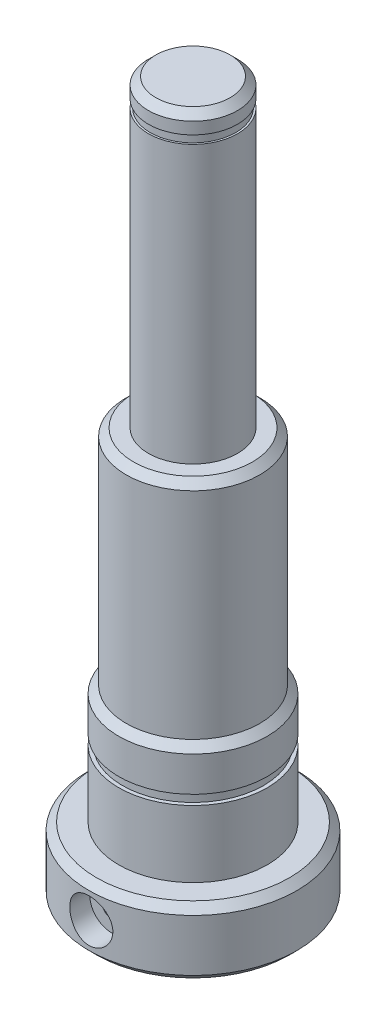
ISO-10303-21;
HEADER;
FILE_DESCRIPTION(('STEP AP214'),'2;1');
FILE_NAME('part.step','',(''),(''),'','','');
FILE_SCHEMA(('AUTOMOTIVE_DESIGN { 1 0 10303 214 1 1 1 1 }'));
ENDSEC;
DATA;
#1=APPLICATION_CONTEXT('core data for automotive mechanical design processes');
#2=APPLICATION_PROTOCOL_DEFINITION('international standard','automotive_design',2000,#1);
#3=PRODUCT_CONTEXT('',#1,'mechanical');
#4=PRODUCT('Part','Part','',(#3));
#5=PRODUCT_RELATED_PRODUCT_CATEGORY('part','',(#4));
#6=PRODUCT_DEFINITION_FORMATION('','',#4);
#7=PRODUCT_DEFINITION_CONTEXT('part definition',#1,'design');
#8=PRODUCT_DEFINITION('design','',#6,#7);
#9=PRODUCT_DEFINITION_SHAPE('','',#8);
#10=(LENGTH_UNIT() NAMED_UNIT(*) SI_UNIT(.MILLI.,.METRE.));
#11=(NAMED_UNIT(*) PLANE_ANGLE_UNIT() SI_UNIT($,.RADIAN.));
#12=(NAMED_UNIT(*) SI_UNIT($,.STERADIAN.) SOLID_ANGLE_UNIT());
#13=UNCERTAINTY_MEASURE_WITH_UNIT(LENGTH_MEASURE(1.E-05),#10,'distance_accuracy_value','');
#14=(GEOMETRIC_REPRESENTATION_CONTEXT(3) GLOBAL_UNCERTAINTY_ASSIGNED_CONTEXT((#13)) GLOBAL_UNIT_ASSIGNED_CONTEXT((#10,
#11,#12)) REPRESENTATION_CONTEXT('',''));
#15=CARTESIAN_POINT('',(0.,0.,0.));
#16=DIRECTION('',(0.,0.,1.));
#17=DIRECTION('',(1.,0.,0.));
#18=AXIS2_PLACEMENT_3D('',#15,#16,#17);
#19=CARTESIAN_POINT('',(-10.,0.,0.));
#20=DIRECTION('',(0.,1.,0.));
#21=DIRECTION('',(-1.,0.,0.));
#22=AXIS2_PLACEMENT_3D('',#19,#20,#21);
#23=PLANE('',#22);
#24=CARTESIAN_POINT('',(0.,0.,0.));
#25=DIRECTION('',(0.,-1.,0.));
#26=DIRECTION('',(1.,0.,0.));
#27=AXIS2_PLACEMENT_3D('',#24,#25,#26);
#28=CIRCLE('',#27,5.05);
#29=CARTESIAN_POINT('',(5.05,0.,0.));
#30=VERTEX_POINT('',#29);
#31=EDGE_CURVE('E264',#30,#30,#28,.T.);
#32=ORIENTED_EDGE('',*,*,#31,.F.);
#33=EDGE_LOOP('',(#32));
#34=FACE_BOUND('',#33,.T.);
#35=CARTESIAN_POINT('',(0.,0.,0.));
#36=DIRECTION('',(0.,1.,0.));
#37=DIRECTION('',(-1.,0.,0.));
#38=AXIS2_PLACEMENT_3D('',#35,#36,#37);
#39=CIRCLE('',#38,13.);
#40=CARTESIAN_POINT('',(-13.,0.,0.));
#41=VERTEX_POINT('',#40);
#42=EDGE_CURVE('E186',#41,#41,#39,.F.);
#43=ORIENTED_EDGE('',*,*,#42,.T.);
#44=EDGE_LOOP('',(#43));
#45=FACE_BOUND('',#44,.T.);
#46=ADVANCED_FACE('F39',(#34,#45),#23,.F.);
#47=CARTESIAN_POINT('',(0.,0.,0.));
#48=DIRECTION('',(0.,-1.,0.));
#49=DIRECTION('',(1.,0.,0.));
#50=AXIS2_PLACEMENT_3D('',#47,#48,#49);
#51=CYLINDRICAL_SURFACE('',#50,14.);
#52=CARTESIAN_POINT('',(2.9,4.49999999999998,13.6963498787086));
#53=CARTESIAN_POINT('',(2.89999419383572,4.33899189271043,13.6963531115589));
#54=CARTESIAN_POINT('',(2.88654567046469,4.17791192499995,13.6992198755548));
#55=CARTESIAN_POINT('',(2.83315693105658,3.86031772805241,13.7103587805877));
#56=CARTESIAN_POINT('',(2.79319627886301,3.70380711821791,13.7186350913543));
#57=CARTESIAN_POINT('',(2.68808300690295,3.39999209421434,13.7396164449994));
#58=CARTESIAN_POINT('',(2.62295640091256,3.2526783553913,13.7523169133426));
#59=CARTESIAN_POINT('',(2.46943239324666,2.97106942830747,13.7807100974141));
#60=CARTESIAN_POINT('',(2.38103598390965,2.8367736852296,13.7964026855361));
#61=CARTESIAN_POINT('',(2.18205302085246,2.58297165466539,13.8292777556743));
#62=CARTESIAN_POINT('',(2.07118088994073,2.46369147457871,13.8464776053231));
#63=CARTESIAN_POINT('',(1.83101056757053,2.24528279381873,13.880276655425));
#64=CARTESIAN_POINT('',(1.70171103465584,2.14615576150634,13.8968758120391));
#65=CARTESIAN_POINT('',(1.42685194414286,1.96998347972187,13.9277912082507));
#66=CARTESIAN_POINT('',(1.28115124652133,1.89315407439079,13.9420845741198));
#67=CARTESIAN_POINT('',(0.978562694793327,1.76515210202879,13.9665824115249));
#68=CARTESIAN_POINT('',(0.821675966610431,1.71397695693532,13.9767872939026));
#69=CARTESIAN_POINT('',(0.503517071550294,1.63944276807035,13.9918356398737));
#70=CARTESIAN_POINT('',(0.342337967901413,1.61570157797417,13.9967526924603));
#71=CARTESIAN_POINT('',(0.0182145482569576,1.59551600391564,14.0009258164044));
#72=CARTESIAN_POINT('',(-0.144729584076193,1.59906880657629,14.0001824712174));
#73=CARTESIAN_POINT('',(-0.465128603892373,1.63308246398363,13.9931752865473));
#74=CARTESIAN_POINT('',(-0.622629318310901,1.66313158736733,13.986995921826));
#75=CARTESIAN_POINT('',(-0.9303031886085,1.74863070927127,13.9699066360982));
#76=CARTESIAN_POINT('',(-1.0804760362834,1.80408177515958,13.9589965163103));
#77=CARTESIAN_POINT('',(-1.37039413565168,1.93918572525244,13.9335336062274));
#78=CARTESIAN_POINT('',(-1.5100629448243,2.01899796381199,13.9189569457963));
#79=CARTESIAN_POINT('',(-1.77417681627177,2.20044043808145,13.8877647093077));
#80=CARTESIAN_POINT('',(-1.89862000325996,2.30207335713007,13.871148882597));
#81=CARTESIAN_POINT('',(-2.1311956456326,2.52652464052962,13.8373442467169));
#82=CARTESIAN_POINT('',(-2.23897989621989,2.64970336528737,13.8201505324226));
#83=CARTESIAN_POINT('',(-2.43242126605807,2.91256319811965,13.7874210955904));
#84=CARTESIAN_POINT('',(-2.5180779036366,3.05224466532831,13.7718854091486));
#85=CARTESIAN_POINT('',(-2.66496539973842,3.34466827327105,13.7442200980446));
#86=CARTESIAN_POINT('',(-2.72613640074427,3.49744132518152,13.7320988414399));
#87=CARTESIAN_POINT('',(-2.82183680504096,3.81140720012852,13.7127548358361));
#88=CARTESIAN_POINT('',(-2.85636995731472,3.97259883493181,13.7055313975405));
#89=CARTESIAN_POINT('',(-2.89728670050617,4.29566073500499,13.6969399332338));
#90=CARTESIAN_POINT('',(-2.90417467653727,4.45746440080765,13.6954670031778));
#91=CARTESIAN_POINT('',(-2.89096588662787,4.77990841463909,13.698261219576));
#92=CARTESIAN_POINT('',(-2.87087076985745,4.94054883316067,13.702528015226));
#93=CARTESIAN_POINT('',(-2.80470210853869,5.25438848473026,13.7162223763224));
#94=CARTESIAN_POINT('',(-2.75890113791714,5.40764776614183,13.7255957635616));
#95=CARTESIAN_POINT('',(-2.64291369972917,5.70431730477971,13.7483991495977));
#96=CARTESIAN_POINT('',(-2.57272510027015,5.84772669964571,13.7618295030289));
#97=CARTESIAN_POINT('',(-2.40882441871586,6.12282363742768,13.7914673051063));
#98=CARTESIAN_POINT('',(-2.3147985478545,6.2543202664384,13.8077108021135));
#99=CARTESIAN_POINT('',(-2.10630777635164,6.49985326061864,13.8410471966416));
#100=CARTESIAN_POINT('',(-1.99184061144914,6.61388768891632,13.8581401881088));
#101=CARTESIAN_POINT('',(-1.74344548610602,6.823188456802,13.8915920807418));
#102=CARTESIAN_POINT('',(-1.60922662680789,6.91811269768244,13.9079341363376));
#103=CARTESIAN_POINT('',(-1.32645412016391,7.0840646834425,13.9377437789464));
#104=CARTESIAN_POINT('',(-1.17790110219979,7.1550934769054,13.9512114920821));
#105=CARTESIAN_POINT('',(-0.8715491822251,7.2707478910436,13.9736833984818));
#106=CARTESIAN_POINT('',(-0.713811451498223,7.31553017971465,13.9827140237285));
#107=CARTESIAN_POINT('',(-0.392845659036279,7.37791429983436,13.9954079655653));
#108=CARTESIAN_POINT('',(-0.229618311902394,7.39551965510691,13.9990719779996));
#109=CARTESIAN_POINT('',(0.0944332349038258,7.40290548875582,14.0006018410895));
#110=CARTESIAN_POINT('',(0.255245456322685,7.39319894565795,13.9985745880682));
#111=CARTESIAN_POINT('',(0.572893884029994,7.34737465224898,13.9891760402659));
#112=CARTESIAN_POINT('',(0.72973014793017,7.31125728485797,13.9818048229648));
#113=CARTESIAN_POINT('',(1.03462624687711,7.21387137084941,13.9625514329466));
#114=CARTESIAN_POINT('',(1.18270789042595,7.15266862061993,13.9506810671197));
#115=CARTESIAN_POINT('',(1.46657194416384,7.00691628119889,13.9237035246461));
#116=CARTESIAN_POINT('',(1.60235329624413,6.92236468599613,13.9085960699104));
#117=CARTESIAN_POINT('',(1.86028639332376,6.73060575116727,13.8764742390957));
#118=CARTESIAN_POINT('',(1.98216349296366,6.62303369623924,13.8594315298296));
#119=CARTESIAN_POINT('',(2.20631240679578,6.38903181149866,13.8255223197402));
#120=CARTESIAN_POINT('',(2.30857954447706,6.26259749623426,13.8086558618532));
#121=CARTESIAN_POINT('',(2.49175012962904,5.99268109455452,13.7767902425913));
#122=CARTESIAN_POINT('',(2.57238924861947,5.84901663507739,13.7618152730426));
#123=CARTESIAN_POINT('',(2.70825336871188,5.54990262491661,13.7357266802901));
#124=CARTESIAN_POINT('',(2.76350085513874,5.39446364371101,13.7246096428755));
#125=CARTESIAN_POINT('',(2.83661364154142,5.11561840642823,13.7096544304373));
#126=CARTESIAN_POINT('',(2.86033988035004,4.99377497518744,13.704696946509));
#127=CARTESIAN_POINT('',(2.89203498521578,4.74796851558947,13.6980434899225));
#128=CARTESIAN_POINT('',(2.90000447180411,4.62400557089675,13.6963473888249));
#129=CARTESIAN_POINT('',(2.9,4.49999999999998,13.6963498787086));
#130=B_SPLINE_CURVE_WITH_KNOTS('',3,(#52,#53,#54,#55,#56,#57,#58,#59,#60,#61,#62,#63,#64,#65,
#66,#67,#68,#69,#70,#71,#72,#73,#74,#75,#76,#77,#78,#79,#80,#81,#82,#83,#84,#85,#86,#87,#88,#89,
#90,#91,#92,#93,#94,#95,#96,#97,#98,#99,#100,#101,#102,#103,#104,#105,#106,#107,#108,#109,#110,
#111,#112,#113,#114,#115,#116,#117,#118,#119,#120,#121,#122,#123,#124,#125,#126,#127,#128,#129),
.UNSPECIFIED.,.T.,.F.,(4,2,2,2,2,2,2,2,2,2,2,2,2,2,2,2,2,2,2,2,2,2,2,2,2,2,2,2,2,2,2,2,2,2,2,2,
2,2,4),(0.,0.482570124451126,0.965512657858809,1.44795730845197,1.93038138857199,
2.41936987488557,2.90839397620443,3.40200502933799,3.89556646827906,4.38216656817056,
4.86871651156156,5.3478365313325,5.82697668516702,6.30932077454342,6.79172421287749,
7.28314117588915,7.77456883513029,8.26719060582867,8.75974303279931,9.2432668563488,
9.72676112892219,10.2052229436821,10.6837265946513,11.1688897315371,11.6541066428144,
12.1473593291057,12.6405903675908,13.1308464596087,13.6210389785495,14.1020863738051,
14.5831267946829,15.0629134888035,15.5427414165305,16.0308236054312,16.5190220459957,
17.012940092556,17.5064199078101,17.8781014435805,18.2497683415254),.UNSPECIFIED.);
#131=CARTESIAN_POINT('',(2.9,4.49999999999998,13.6963498787086));
#132=VERTEX_POINT('',#131);
#133=EDGE_CURVE('E10',#132,#132,#130,.T.);
#134=ORIENTED_EDGE('',*,*,#133,.T.);
#135=EDGE_LOOP('',(#134));
#136=FACE_BOUND('',#135,.T.);
#137=CARTESIAN_POINT('',(0.,0.99999999999998,0.));
#138=DIRECTION('',(0.,1.,0.));
#139=DIRECTION('',(-1.,0.,0.));
#140=AXIS2_PLACEMENT_3D('',#137,#138,#139);
#141=CIRCLE('',#140,14.);
#142=CARTESIAN_POINT('',(-14.,0.99999999999998,0.));
#143=VERTEX_POINT('',#142);
#144=EDGE_CURVE('E59',#143,#143,#141,.T.);
#145=ORIENTED_EDGE('',*,*,#144,.T.);
#146=EDGE_LOOP('',(#145));
#147=FACE_BOUND('',#146,.T.);
#148=CARTESIAN_POINT('',(0.,8.,0.));
#149=DIRECTION('',(0.,-1.,0.));
#150=DIRECTION('',(1.,0.,0.));
#151=AXIS2_PLACEMENT_3D('',#148,#149,#150);
#152=CIRCLE('',#151,14.);
#153=CARTESIAN_POINT('',(14.,8.,0.));
#154=VERTEX_POINT('',#153);
#155=EDGE_CURVE('E188',#154,#154,#152,.T.);
#156=ORIENTED_EDGE('',*,*,#155,.T.);
#157=EDGE_LOOP('',(#156));
#158=FACE_BOUND('',#157,.T.);
#159=ADVANCED_FACE('F67',(#136,#147,#158),#51,.T.);
#160=CARTESIAN_POINT('',(-10.,9.,0.));
#161=DIRECTION('',(0.,-1.,0.));
#162=DIRECTION('',(1.,0.,0.));
#163=AXIS2_PLACEMENT_3D('',#160,#161,#162);
#164=PLANE('',#163);
#165=CARTESIAN_POINT('',(0.,9.,0.));
#166=DIRECTION('',(0.,-1.,0.));
#167=DIRECTION('',(1.,0.,0.));
#168=AXIS2_PLACEMENT_3D('',#165,#166,#167);
#169=CIRCLE('',#168,13.);
#170=CARTESIAN_POINT('',(13.,9.,0.));
#171=VERTEX_POINT('',#170);
#172=EDGE_CURVE('E54',#171,#171,#169,.F.);
#173=ORIENTED_EDGE('',*,*,#172,.T.);
#174=EDGE_LOOP('',(#173));
#175=FACE_BOUND('',#174,.T.);
#176=CARTESIAN_POINT('',(0.,9.,0.));
#177=DIRECTION('',(0.,-1.,0.));
#178=DIRECTION('',(1.,0.,0.));
#179=AXIS2_PLACEMENT_3D('',#176,#177,#178);
#180=CIRCLE('',#179,10.);
#181=CARTESIAN_POINT('',(10.,9.,0.));
#182=VERTEX_POINT('',#181);
#183=EDGE_CURVE('E219',#182,#182,#180,.T.);
#184=ORIENTED_EDGE('',*,*,#183,.T.);
#185=EDGE_LOOP('',(#184));
#186=FACE_BOUND('',#185,.T.);
#187=ADVANCED_FACE('F137',(#175,#186),#164,.F.);
#188=CARTESIAN_POINT('',(0.,0.,0.));
#189=DIRECTION('',(0.,-1.,0.));
#190=DIRECTION('',(1.,0.,0.));
#191=AXIS2_PLACEMENT_3D('',#188,#189,#190);
#192=CYLINDRICAL_SURFACE('',#191,10.);
#193=ORIENTED_EDGE('',*,*,#183,.F.);
#194=EDGE_LOOP('',(#193));
#195=FACE_BOUND('',#194,.T.);
#196=CARTESIAN_POINT('',(0.,18.,0.));
#197=DIRECTION('',(0.,-1.,0.));
#198=DIRECTION('',(1.,0.,0.));
#199=AXIS2_PLACEMENT_3D('',#196,#197,#198);
#200=CIRCLE('',#199,10.);
#201=CARTESIAN_POINT('',(10.,18.,0.));
#202=VERTEX_POINT('',#201);
#203=EDGE_CURVE('E223',#202,#202,#200,.T.);
#204=ORIENTED_EDGE('',*,*,#203,.T.);
#205=EDGE_LOOP('',(#204));
#206=FACE_BOUND('',#205,.T.);
#207=ADVANCED_FACE('F134',(#195,#206),#192,.T.);
#208=CARTESIAN_POINT('',(-10.,18.,0.));
#209=DIRECTION('',(0.,-1.,0.));
#210=DIRECTION('',(1.,0.,0.));
#211=AXIS2_PLACEMENT_3D('',#208,#209,#210);
#212=PLANE('',#211);
#213=ORIENTED_EDGE('',*,*,#203,.F.);
#214=EDGE_LOOP('',(#213));
#215=FACE_BOUND('',#214,.T.);
#216=CARTESIAN_POINT('',(0.,18.,0.));
#217=DIRECTION('',(0.,-1.,0.));
#218=DIRECTION('',(1.,0.,0.));
#219=AXIS2_PLACEMENT_3D('',#216,#217,#218);
#220=CIRCLE('',#219,9.5);
#221=CARTESIAN_POINT('',(9.5,18.,0.));
#222=VERTEX_POINT('',#221);
#223=EDGE_CURVE('E227',#222,#222,#220,.T.);
#224=ORIENTED_EDGE('',*,*,#223,.T.);
#225=EDGE_LOOP('',(#224));
#226=FACE_BOUND('',#225,.T.);
#227=ADVANCED_FACE('F130',(#215,#226),#212,.F.);
#228=CARTESIAN_POINT('',(0.,0.,0.));
#229=DIRECTION('',(0.,-1.,0.));
#230=DIRECTION('',(1.,0.,0.));
#231=AXIS2_PLACEMENT_3D('',#228,#229,#230);
#232=CYLINDRICAL_SURFACE('',#231,9.5);
#233=ORIENTED_EDGE('',*,*,#223,.F.);
#234=EDGE_LOOP('',(#233));
#235=FACE_BOUND('',#234,.T.);
#236=CARTESIAN_POINT('',(0.,19.3,0.));
#237=DIRECTION('',(0.,-1.,0.));
#238=DIRECTION('',(1.,0.,0.));
#239=AXIS2_PLACEMENT_3D('',#236,#237,#238);
#240=CIRCLE('',#239,9.5);
#241=CARTESIAN_POINT('',(9.5,19.3,0.));
#242=VERTEX_POINT('',#241);
#243=EDGE_CURVE('E231',#242,#242,#240,.T.);
#244=ORIENTED_EDGE('',*,*,#243,.T.);
#245=EDGE_LOOP('',(#244));
#246=FACE_BOUND('',#245,.T.);
#247=ADVANCED_FACE('F126',(#235,#246),#232,.T.);
#248=CARTESIAN_POINT('',(-10.,19.3,0.));
#249=DIRECTION('',(0.,1.,0.));
#250=DIRECTION('',(-1.,0.,0.));
#251=AXIS2_PLACEMENT_3D('',#248,#249,#250);
#252=PLANE('',#251);
#253=ORIENTED_EDGE('',*,*,#243,.F.);
#254=EDGE_LOOP('',(#253));
#255=FACE_BOUND('',#254,.T.);
#256=CARTESIAN_POINT('',(0.,19.3,0.));
#257=DIRECTION('',(0.,-1.,0.));
#258=DIRECTION('',(1.,0.,0.));
#259=AXIS2_PLACEMENT_3D('',#256,#257,#258);
#260=CIRCLE('',#259,10.);
#261=CARTESIAN_POINT('',(10.,19.3,0.));
#262=VERTEX_POINT('',#261);
#263=EDGE_CURVE('E235',#262,#262,#260,.T.);
#264=ORIENTED_EDGE('',*,*,#263,.T.);
#265=EDGE_LOOP('',(#264));
#266=FACE_BOUND('',#265,.T.);
#267=ADVANCED_FACE('F122',(#255,#266),#252,.F.);
#268=CARTESIAN_POINT('',(0.,0.,0.));
#269=DIRECTION('',(0.,-1.,0.));
#270=DIRECTION('',(1.,0.,0.));
#271=AXIS2_PLACEMENT_3D('',#268,#269,#270);
#272=CYLINDRICAL_SURFACE('',#271,10.);
#273=CARTESIAN_POINT('',(0.,24.,0.));
#274=DIRECTION('',(0.,-1.,0.));
#275=DIRECTION('',(1.,0.,0.));
#276=AXIS2_PLACEMENT_3D('',#273,#274,#275);
#277=CIRCLE('',#276,10.);
#278=CARTESIAN_POINT('',(10.,24.,0.));
#279=VERTEX_POINT('',#278);
#280=EDGE_CURVE('E189',#279,#279,#277,.T.);
#281=ORIENTED_EDGE('',*,*,#280,.T.);
#282=EDGE_LOOP('',(#281));
#283=FACE_BOUND('',#282,.T.);
#284=ORIENTED_EDGE('',*,*,#263,.F.);
#285=EDGE_LOOP('',(#284));
#286=FACE_BOUND('',#285,.T.);
#287=ADVANCED_FACE('F118',(#283,#286),#272,.T.);
#288=CARTESIAN_POINT('',(0.,0.,0.));
#289=DIRECTION('',(0.,-1.,0.));
#290=DIRECTION('',(1.,0.,0.));
#291=AXIS2_PLACEMENT_3D('',#288,#289,#290);
#292=CYLINDRICAL_SURFACE('',#291,9.);
#293=CARTESIAN_POINT('',(0.,54.,0.));
#294=DIRECTION('',(0.,-1.,0.));
#295=DIRECTION('',(1.,0.,0.));
#296=AXIS2_PLACEMENT_3D('',#293,#294,#295);
#297=CIRCLE('',#296,9.);
#298=CARTESIAN_POINT('',(9.,54.,0.));
#299=VERTEX_POINT('',#298);
#300=EDGE_CURVE('E207',#299,#299,#297,.T.);
#301=ORIENTED_EDGE('',*,*,#300,.T.);
#302=EDGE_LOOP('',(#301));
#303=FACE_BOUND('',#302,.T.);
#304=CARTESIAN_POINT('',(0.,25.,0.));
#305=DIRECTION('',(0.,-1.,0.));
#306=DIRECTION('',(1.,0.,0.));
#307=AXIS2_PLACEMENT_3D('',#304,#305,#306);
#308=CIRCLE('',#307,9.);
#309=CARTESIAN_POINT('',(9.,25.,0.));
#310=VERTEX_POINT('',#309);
#311=EDGE_CURVE('E239',#310,#310,#308,.T.);
#312=ORIENTED_EDGE('',*,*,#311,.F.);
#313=EDGE_LOOP('',(#312));
#314=FACE_BOUND('',#313,.T.);
#315=ADVANCED_FACE('F114',(#303,#314),#292,.T.);
#316=CARTESIAN_POINT('',(-9.,55.,0.));
#317=DIRECTION('',(0.,-1.,0.));
#318=DIRECTION('',(1.,0.,0.));
#319=AXIS2_PLACEMENT_3D('',#316,#317,#318);
#320=PLANE('',#319);
#321=CARTESIAN_POINT('',(0.,55.,0.));
#322=DIRECTION('',(0.,-1.,0.));
#323=DIRECTION('',(1.,0.,0.));
#324=AXIS2_PLACEMENT_3D('',#321,#322,#323);
#325=CIRCLE('',#324,8.00000000000002);
#326=CARTESIAN_POINT('',(8.00000000000002,55.,0.));
#327=VERTEX_POINT('',#326);
#328=EDGE_CURVE('E196',#327,#327,#325,.F.);
#329=ORIENTED_EDGE('',*,*,#328,.T.);
#330=EDGE_LOOP('',(#329));
#331=FACE_BOUND('',#330,.T.);
#332=CARTESIAN_POINT('',(0.,55.,0.));
#333=DIRECTION('',(0.,-1.,0.));
#334=DIRECTION('',(1.,0.,0.));
#335=AXIS2_PLACEMENT_3D('',#332,#333,#334);
#336=CIRCLE('',#335,6.);
#337=CARTESIAN_POINT('',(6.,55.,0.));
#338=VERTEX_POINT('',#337);
#339=EDGE_CURVE('E243',#338,#338,#336,.T.);
#340=ORIENTED_EDGE('',*,*,#339,.T.);
#341=EDGE_LOOP('',(#340));
#342=FACE_BOUND('',#341,.T.);
#343=ADVANCED_FACE('F110',(#331,#342),#320,.F.);
#344=CARTESIAN_POINT('',(0.,0.,0.));
#345=DIRECTION('',(0.,-1.,0.));
#346=DIRECTION('',(1.,0.,0.));
#347=AXIS2_PLACEMENT_3D('',#344,#345,#346);
#348=CYLINDRICAL_SURFACE('',#347,6.);
#349=ORIENTED_EDGE('',*,*,#339,.F.);
#350=EDGE_LOOP('',(#349));
#351=FACE_BOUND('',#350,.T.);
#352=CARTESIAN_POINT('',(0.,92.3,0.));
#353=DIRECTION('',(0.,-1.,0.));
#354=DIRECTION('',(1.,0.,0.));
#355=AXIS2_PLACEMENT_3D('',#352,#353,#354);
#356=CIRCLE('',#355,6.);
#357=CARTESIAN_POINT('',(6.,92.3,0.));
#358=VERTEX_POINT('',#357);
#359=EDGE_CURVE('E247',#358,#358,#356,.T.);
#360=ORIENTED_EDGE('',*,*,#359,.T.);
#361=EDGE_LOOP('',(#360));
#362=FACE_BOUND('',#361,.T.);
#363=ADVANCED_FACE('F106',(#351,#362),#348,.T.);
#364=CARTESIAN_POINT('',(-6.,92.3,0.));
#365=DIRECTION('',(0.,-1.,0.));
#366=DIRECTION('',(1.,0.,0.));
#367=AXIS2_PLACEMENT_3D('',#364,#365,#366);
#368=PLANE('',#367);
#369=ORIENTED_EDGE('',*,*,#359,.F.);
#370=EDGE_LOOP('',(#369));
#371=FACE_BOUND('',#370,.T.);
#372=CARTESIAN_POINT('',(0.,92.3,0.));
#373=DIRECTION('',(0.,-1.,0.));
#374=DIRECTION('',(1.,0.,0.));
#375=AXIS2_PLACEMENT_3D('',#372,#373,#374);
#376=CIRCLE('',#375,5.75);
#377=CARTESIAN_POINT('',(5.75,92.3,0.));
#378=VERTEX_POINT('',#377);
#379=EDGE_CURVE('E251',#378,#378,#376,.T.);
#380=ORIENTED_EDGE('',*,*,#379,.T.);
#381=EDGE_LOOP('',(#380));
#382=FACE_BOUND('',#381,.T.);
#383=ADVANCED_FACE('F102',(#371,#382),#368,.F.);
#384=CARTESIAN_POINT('',(0.,0.,0.));
#385=DIRECTION('',(0.,-1.,0.));
#386=DIRECTION('',(1.,0.,0.));
#387=AXIS2_PLACEMENT_3D('',#384,#385,#386);
#388=CYLINDRICAL_SURFACE('',#387,5.75);
#389=ORIENTED_EDGE('',*,*,#379,.F.);
#390=EDGE_LOOP('',(#389));
#391=FACE_BOUND('',#390,.T.);
#392=CARTESIAN_POINT('',(0.,93.4,0.));
#393=DIRECTION('',(0.,-1.,0.));
#394=DIRECTION('',(1.,0.,0.));
#395=AXIS2_PLACEMENT_3D('',#392,#393,#394);
#396=CIRCLE('',#395,5.75);
#397=CARTESIAN_POINT('',(5.75,93.4,0.));
#398=VERTEX_POINT('',#397);
#399=EDGE_CURVE('E255',#398,#398,#396,.T.);
#400=ORIENTED_EDGE('',*,*,#399,.T.);
#401=EDGE_LOOP('',(#400));
#402=FACE_BOUND('',#401,.T.);
#403=ADVANCED_FACE('F98',(#391,#402),#388,.T.);
#404=CARTESIAN_POINT('',(-6.,93.4,0.));
#405=DIRECTION('',(0.,1.,0.));
#406=DIRECTION('',(-1.,0.,0.));
#407=AXIS2_PLACEMENT_3D('',#404,#405,#406);
#408=PLANE('',#407);
#409=ORIENTED_EDGE('',*,*,#399,.F.);
#410=EDGE_LOOP('',(#409));
#411=FACE_BOUND('',#410,.T.);
#412=CARTESIAN_POINT('',(0.,93.4,0.));
#413=DIRECTION('',(0.,-1.,0.));
#414=DIRECTION('',(1.,0.,0.));
#415=AXIS2_PLACEMENT_3D('',#412,#413,#414);
#416=CIRCLE('',#415,6.);
#417=CARTESIAN_POINT('',(6.,93.4,0.));
#418=VERTEX_POINT('',#417);
#419=EDGE_CURVE('E259',#418,#418,#416,.T.);
#420=ORIENTED_EDGE('',*,*,#419,.T.);
#421=EDGE_LOOP('',(#420));
#422=FACE_BOUND('',#421,.T.);
#423=ADVANCED_FACE('F94',(#411,#422),#408,.F.);
#424=CARTESIAN_POINT('',(0.,0.,0.));
#425=DIRECTION('',(0.,-1.,0.));
#426=DIRECTION('',(1.,0.,0.));
#427=AXIS2_PLACEMENT_3D('',#424,#425,#426);
#428=CYLINDRICAL_SURFACE('',#427,6.);
#429=CARTESIAN_POINT('',(0.,95.,0.));
#430=DIRECTION('',(0.,-1.,0.));
#431=DIRECTION('',(1.,0.,0.));
#432=AXIS2_PLACEMENT_3D('',#429,#430,#431);
#433=CIRCLE('',#432,6.);
#434=CARTESIAN_POINT('',(6.,95.,0.));
#435=VERTEX_POINT('',#434);
#436=EDGE_CURVE('E215',#435,#435,#433,.T.);
#437=ORIENTED_EDGE('',*,*,#436,.T.);
#438=EDGE_LOOP('',(#437));
#439=FACE_BOUND('',#438,.T.);
#440=ORIENTED_EDGE('',*,*,#419,.F.);
#441=EDGE_LOOP('',(#440));
#442=FACE_BOUND('',#441,.T.);
#443=ADVANCED_FACE('F90',(#439,#442),#428,.T.);
#444=CARTESIAN_POINT('',(-6.,96.,0.));
#445=DIRECTION('',(0.,-1.,0.));
#446=DIRECTION('',(1.,0.,0.));
#447=AXIS2_PLACEMENT_3D('',#444,#445,#446);
#448=PLANE('',#447);
#449=CARTESIAN_POINT('',(0.,96.,0.));
#450=DIRECTION('',(0.,-1.,0.));
#451=DIRECTION('',(1.,0.,0.));
#452=AXIS2_PLACEMENT_3D('',#449,#450,#451);
#453=CIRCLE('',#452,4.99999999999999);
#454=CARTESIAN_POINT('',(4.99999999999999,96.,0.));
#455=VERTEX_POINT('',#454);
#456=EDGE_CURVE('E211',#455,#455,#453,.F.);
#457=ORIENTED_EDGE('',*,*,#456,.T.);
#458=EDGE_LOOP('',(#457));
#459=FACE_BOUND('',#458,.T.);
#460=ADVANCED_FACE('F86',(#459),#448,.F.);
#461=CARTESIAN_POINT('',(0.,95.,0.));
#462=DIRECTION('',(0.,-1.,0.));
#463=DIRECTION('',(1.,0.,0.));
#464=AXIS2_PLACEMENT_3D('',#461,#462,#463);
#465=CONICAL_SURFACE('',#464,6.,0.785398163397453);
#466=ORIENTED_EDGE('',*,*,#456,.F.);
#467=EDGE_LOOP('',(#466));
#468=FACE_BOUND('',#467,.T.);
#469=ORIENTED_EDGE('',*,*,#436,.F.);
#470=EDGE_LOOP('',(#469));
#471=FACE_BOUND('',#470,.T.);
#472=ADVANCED_FACE('F89',(#468,#471),#465,.T.);
#473=CARTESIAN_POINT('',(0.,54.,0.));
#474=DIRECTION('',(0.,-1.,0.));
#475=DIRECTION('',(1.,0.,0.));
#476=AXIS2_PLACEMENT_3D('',#473,#474,#475);
#477=CONICAL_SURFACE('',#476,9.,0.785398163397454);
#478=ORIENTED_EDGE('',*,*,#328,.F.);
#479=EDGE_LOOP('',(#478));
#480=FACE_BOUND('',#479,.T.);
#481=ORIENTED_EDGE('',*,*,#300,.F.);
#482=EDGE_LOOP('',(#481));
#483=FACE_BOUND('',#482,.T.);
#484=ADVANCED_FACE('F158',(#480,#483),#477,.T.);
#485=CARTESIAN_POINT('',(0.,24.,0.));
#486=DIRECTION('',(0.,-1.,0.));
#487=DIRECTION('',(1.,0.,0.));
#488=AXIS2_PLACEMENT_3D('',#485,#486,#487);
#489=CONICAL_SURFACE('',#488,10.,0.785398163397451);
#490=ORIENTED_EDGE('',*,*,#311,.T.);
#491=EDGE_LOOP('',(#490));
#492=FACE_BOUND('',#491,.T.);
#493=ORIENTED_EDGE('',*,*,#280,.F.);
#494=EDGE_LOOP('',(#493));
#495=FACE_BOUND('',#494,.T.);
#496=ADVANCED_FACE('F165',(#492,#495),#489,.T.);
#497=CARTESIAN_POINT('',(0.,0.,0.));
#498=DIRECTION('',(0.,1.,0.));
#499=DIRECTION('',(-1.,0.,0.));
#500=AXIS2_PLACEMENT_3D('',#497,#498,#499);
#501=CONICAL_SURFACE('',#500,13.,0.785398163397445);
#502=ORIENTED_EDGE('',*,*,#144,.F.);
#503=EDGE_LOOP('',(#502));
#504=FACE_BOUND('',#503,.T.);
#505=ORIENTED_EDGE('',*,*,#42,.F.);
#506=EDGE_LOOP('',(#505));
#507=FACE_BOUND('',#506,.T.);
#508=ADVANCED_FACE('F171',(#504,#507),#501,.T.);
#509=CARTESIAN_POINT('',(0.,8.,0.));
#510=DIRECTION('',(0.,-1.,0.));
#511=DIRECTION('',(1.,0.,0.));
#512=AXIS2_PLACEMENT_3D('',#509,#510,#511);
#513=CONICAL_SURFACE('',#512,14.,0.785398163397452);
#514=ORIENTED_EDGE('',*,*,#172,.F.);
#515=EDGE_LOOP('',(#514));
#516=FACE_BOUND('',#515,.T.);
#517=ORIENTED_EDGE('',*,*,#155,.F.);
#518=EDGE_LOOP('',(#517));
#519=FACE_BOUND('',#518,.T.);
#520=ADVANCED_FACE('F42',(#516,#519),#513,.T.);
#521=CARTESIAN_POINT('',(0.,20.5,0.));
#522=DIRECTION('',(0.,-1.,0.));
#523=DIRECTION('',(1.,0.,0.));
#524=AXIS2_PLACEMENT_3D('',#521,#522,#523);
#525=CYLINDRICAL_SURFACE('',#524,5.05);
#526=CARTESIAN_POINT('',(1.24999999999999,4.49999999999998,4.89285192909003));
#527=CARTESIAN_POINT('',(1.24999799960223,4.56904899427532,4.89285325986225));
#528=CARTESIAN_POINT('',(1.24425919738339,4.63812027397218,4.89432953897076));
#529=CARTESIAN_POINT('',(1.22149124411961,4.77428094584828,4.9000604243961));
#530=CARTESIAN_POINT('',(1.20445539062796,4.84136913678055,4.90431668002735));
#531=CARTESIAN_POINT('',(1.1596771644109,4.97157444669652,4.91509660554894));
#532=CARTESIAN_POINT('',(1.13194843777678,5.03469650827783,4.92161738443675));
#533=CARTESIAN_POINT('',(1.06661295219816,5.15539920831295,4.93618804146209));
#534=CARTESIAN_POINT('',(1.02900582476756,5.21297963994225,4.94423797663742));
#535=CARTESIAN_POINT('',(0.944114497378393,5.3222069789118,4.96115432751429));
#536=CARTESIAN_POINT('',(0.896656315427363,5.37371670653053,4.97003357782656));
#537=CARTESIAN_POINT('',(0.79378486067437,5.46813253546629,4.98749666970276));
#538=CARTESIAN_POINT('',(0.738370856096,5.511037844478,4.99608048400235));
#539=CARTESIAN_POINT('',(0.620222630443133,5.58758661293105,5.01212735946694));
#540=CARTESIAN_POINT('',(0.557398751838634,5.62109554348767,5.0195735086527));
#541=CARTESIAN_POINT('',(0.426794993655838,5.67702600941007,5.0323597717824));
#542=CARTESIAN_POINT('',(0.359015832085215,5.69944914743803,5.03770019012717));
#543=CARTESIAN_POINT('',(0.221855329253378,5.73213278590323,5.04558254212881));
#544=CARTESIAN_POINT('',(0.152532611697581,5.74262617847196,5.04817799006653));
#545=CARTESIAN_POINT('',(0.013065411903701,5.75188325125696,5.05046435905435));
#546=CARTESIAN_POINT('',(-0.0570789496643305,5.75064863285014,5.05015570140172));
#547=CARTESIAN_POINT('',(-0.194583876064237,5.73665272966212,5.04670856144239));
#548=CARTESIAN_POINT('',(-0.261971804316104,5.72414279842543,5.04363178967233));
#549=CARTESIAN_POINT('',(-0.393660598899099,5.68835510871337,5.03506585202171));
#550=CARTESIAN_POINT('',(-0.457961302536817,5.66507678344121,5.02957655915835));
#551=CARTESIAN_POINT('',(-0.582315556629652,5.60820816041304,5.01670755155018));
#552=CARTESIAN_POINT('',(-0.642326213429029,5.57452792863124,5.00931144661358));
#553=CARTESIAN_POINT('',(-0.755932256137105,5.49787966951989,4.99343183984585));
#554=CARTESIAN_POINT('',(-0.809526543211384,5.45491005486366,4.9849481522746));
#555=CARTESIAN_POINT('',(-0.910277262666207,5.35955353836139,4.96755288392321));
#556=CARTESIAN_POINT('',(-0.957225063868478,5.30694695274417,4.95863592257478));
#557=CARTESIAN_POINT('',(-1.0416782988897,5.19451411780003,4.94158555718702));
#558=CARTESIAN_POINT('',(-1.07918330904213,5.13468754471445,4.93345218831498));
#559=CARTESIAN_POINT('',(-1.14381638924585,5.00910983135181,4.91887101054143));
#560=CARTESIAN_POINT('',(-1.17089514804465,4.94333231159218,4.91243125600365));
#561=CARTESIAN_POINT('',(-1.21354578515332,4.80796086494128,4.9020703334071));
#562=CARTESIAN_POINT('',(-1.22912007093019,4.73836773979349,4.8981486384327));
#563=CARTESIAN_POINT('',(-1.24797542268122,4.59927301875572,4.89337820559745));
#564=CARTESIAN_POINT('',(-1.25156456868681,4.52981577672093,4.89245247562419));
#565=CARTESIAN_POINT('',(-1.24719041245857,4.39129477942234,4.89356937016896));
#566=CARTESIAN_POINT('',(-1.23922815040771,4.32223098929111,4.89561172741626));
#567=CARTESIAN_POINT('',(-1.21224710130135,4.18759530746835,4.90236098487751));
#568=CARTESIAN_POINT('',(-1.19340686396177,4.12198527035597,4.9070248244135));
#569=CARTESIAN_POINT('',(-1.14540224229134,3.99485451494002,4.91845083681968));
#570=CARTESIAN_POINT('',(-1.11623665362075,3.93333427466135,4.92521325445478));
#571=CARTESIAN_POINT('',(-1.04776158987826,3.81482175845766,4.94023715967242));
#572=CARTESIAN_POINT('',(-1.00826745388285,3.75793959494983,4.94852502574764));
#573=CARTESIAN_POINT('',(-0.920490551187067,3.65149680734676,4.96560088416425));
#574=CARTESIAN_POINT('',(-0.872206369921447,3.60193736401187,4.97438895684624));
#575=CARTESIAN_POINT('',(-0.766807730630085,3.51030323149929,4.99173537379916));
#576=CARTESIAN_POINT('',(-0.709506080619683,3.46844141050885,5.00028283175562));
#577=CARTESIAN_POINT('',(-0.588507368029789,3.39493483055829,5.01596202791123));
#578=CARTESIAN_POINT('',(-0.524810637440553,3.36328954158262,5.02309383954421));
#579=CARTESIAN_POINT('',(-0.393267836501793,3.31138635285678,5.03509348266364));
#580=CARTESIAN_POINT('',(-0.325455381673013,3.29104716011511,5.03997743177919));
#581=CARTESIAN_POINT('',(-0.187238404568129,3.26208850315653,5.04700155521492));
#582=CARTESIAN_POINT('',(-0.11683437460967,3.25346682466176,5.04914224792838));
#583=CARTESIAN_POINT('',(0.0225657696316767,3.24831043037729,5.050417981119));
#584=CARTESIAN_POINT('',(0.0915497154392209,3.2514612794881,5.04963121412563));
#585=CARTESIAN_POINT('',(0.227972686497189,3.26904170807647,5.04531333425092));
#586=CARTESIAN_POINT('',(0.29541175599161,3.28347096413294,5.04178230006456));
#587=CARTESIAN_POINT('',(0.426508625615059,3.32303137004308,5.03238421805759));
#588=CARTESIAN_POINT('',(0.490184210053926,3.34810667267178,5.02652937083445));
#589=CARTESIAN_POINT('',(0.612460160550336,3.40819651350641,5.01310087106986));
#590=CARTESIAN_POINT('',(0.671059896822062,3.44321228277677,5.0055270056621));
#591=CARTESIAN_POINT('',(0.783015362021664,3.52315360423788,4.98925498535591));
#592=CARTESIAN_POINT('',(0.836215040687893,3.56829316804821,4.98053454871536));
#593=CARTESIAN_POINT('',(0.934391318018498,3.66678385261775,4.963053994935));
#594=CARTESIAN_POINT('',(0.979365838967691,3.72013704192768,4.95429386834043));
#595=CARTESIAN_POINT('',(1.06061730149788,3.83470885312871,4.93754466200617));
#596=CARTESIAN_POINT('',(1.09672113122879,3.89605290649109,4.92957250843343));
#597=CARTESIAN_POINT('',(1.15804956409342,4.02412807116975,4.91552825938659));
#598=CARTESIAN_POINT('',(1.18328219417024,4.09085516445167,4.90945476291776));
#599=CARTESIAN_POINT('',(1.21833167104105,4.21456821652789,4.9008595658226));
#600=CARTESIAN_POINT('',(1.23018168035118,4.27095486526745,4.89787906696953));
#601=CARTESIAN_POINT('',(1.24601635749019,4.38488924348264,4.89387477379724));
#602=CARTESIAN_POINT('',(1.25000166764398,4.44243687775054,4.89285081968351));
#603=CARTESIAN_POINT('',(1.24999999999999,4.49999999999998,4.89285192909003));
#604=B_SPLINE_CURVE_WITH_KNOTS('',3,(#526,#527,#528,#529,#530,#531,#532,#533,#534,#535,#536,
#537,#538,#539,#540,#541,#542,#543,#544,#545,#546,#547,#548,#549,#550,#551,#552,#553,#554,#555,
#556,#557,#558,#559,#560,#561,#562,#563,#564,#565,#566,#567,#568,#569,#570,#571,#572,#573,#574,
#575,#576,#577,#578,#579,#580,#581,#582,#583,#584,#585,#586,#587,#588,#589,#590,#591,#592,#593,
#594,#595,#596,#597,#598,#599,#600,#601,#602,#603),.UNSPECIFIED.,.T.,.F.,(4,2,2,2,2,2,2,2,2,2,2,
2,2,2,2,2,2,2,2,2,2,2,2,2,2,2,2,2,2,2,2,2,2,2,2,2,2,2,4),(0.,0.20693563072184,0.413994144609278,
0.620789283243474,0.827592136887291,1.03841704929009,1.2492613658024,1.46298593849301,
1.67667960418966,1.88612578219748,2.09554157641289,2.30040141072155,2.50527202909957,
2.71196602385897,2.91869536548585,3.13091175416548,3.34313766259026,3.55635531885135,
3.76952834377644,3.97717771855393,4.18480839604915,4.3891241972201,4.59346383745916,
4.80174151884816,5.01005274764474,5.2234622141118,5.43686060749474,5.64870409446337,
5.86050754345245,6.06669482887941,6.27287620186947,6.47798909471008,6.68312740058537,
6.89309810589521,7.10312177779553,7.31696622512174,7.53065250487341,7.70317976784189,
7.87569293959799),.UNSPECIFIED.);
#605=CARTESIAN_POINT('',(1.24999999999999,4.49999999999998,4.89285192909003));
#606=VERTEX_POINT('',#605);
#607=EDGE_CURVE('E44',#606,#606,#604,.T.);
#608=ORIENTED_EDGE('',*,*,#607,.T.);
#609=EDGE_LOOP('',(#608));
#610=FACE_BOUND('',#609,.T.);
#611=CARTESIAN_POINT('',(0.,20.5,0.));
#612=DIRECTION('',(0.,-1.,0.));
#613=DIRECTION('',(1.,0.,0.));
#614=AXIS2_PLACEMENT_3D('',#611,#612,#613);
#615=CIRCLE('',#614,5.05);
#616=CARTESIAN_POINT('',(5.05,20.5,0.));
#617=VERTEX_POINT('',#616);
#618=EDGE_CURVE('E263',#617,#617,#615,.T.);
#619=ORIENTED_EDGE('',*,*,#618,.F.);
#620=EDGE_LOOP('',(#619));
#621=FACE_BOUND('',#620,.T.);
#622=ORIENTED_EDGE('',*,*,#31,.T.);
#623=EDGE_LOOP('',(#622));
#624=FACE_BOUND('',#623,.T.);
#625=ADVANCED_FACE('F80',(#610,#621,#624),#525,.F.);
#626=CARTESIAN_POINT('',(0.,20.5,0.));
#627=DIRECTION('',(0.,-1.,0.));
#628=DIRECTION('',(1.,0.,0.));
#629=AXIS2_PLACEMENT_3D('',#626,#627,#628);
#630=PLANE('',#629);
#631=ORIENTED_EDGE('',*,*,#618,.T.);
#632=EDGE_LOOP('',(#631));
#633=FACE_BOUND('',#632,.T.);
#634=ADVANCED_FACE('F77',(#633),#630,.T.);
#635=CARTESIAN_POINT('',(0.,4.49999999999998,11.));
#636=DIRECTION('',(0.,0.,1.));
#637=DIRECTION('',(1.,0.,0.));
#638=AXIS2_PLACEMENT_3D('',#635,#636,#637);
#639=CYLINDRICAL_SURFACE('',#638,2.9);
#640=CARTESIAN_POINT('',(0.,4.49999999999998,11.));
#641=DIRECTION('',(0.,0.,1.));
#642=DIRECTION('',(1.,0.,0.));
#643=AXIS2_PLACEMENT_3D('',#640,#641,#642);
#644=CIRCLE('',#643,2.9);
#645=CARTESIAN_POINT('',(2.9,4.49999999999998,11.));
#646=VERTEX_POINT('',#645);
#647=EDGE_CURVE('E268',#646,#646,#644,.T.);
#648=ORIENTED_EDGE('',*,*,#647,.F.);
#649=EDGE_LOOP('',(#648));
#650=FACE_BOUND('',#649,.T.);
#651=ORIENTED_EDGE('',*,*,#133,.F.);
#652=EDGE_LOOP('',(#651));
#653=FACE_BOUND('',#652,.T.);
#654=ADVANCED_FACE('F71',(#650,#653),#639,.F.);
#655=CARTESIAN_POINT('',(0.,4.49999999999998,11.));
#656=DIRECTION('',(0.,0.,1.));
#657=DIRECTION('',(1.,0.,0.));
#658=AXIS2_PLACEMENT_3D('',#655,#656,#657);
#659=PLANE('',#658);
#660=CARTESIAN_POINT('',(0.,4.49999999999998,11.));
#661=DIRECTION('',(0.,0.,1.));
#662=DIRECTION('',(1.,0.,0.));
#663=AXIS2_PLACEMENT_3D('',#660,#661,#662);
#664=CIRCLE('',#663,1.24999999999999);
#665=CARTESIAN_POINT('',(1.24999999999999,4.49999999999998,11.));
#666=VERTEX_POINT('',#665);
#667=EDGE_CURVE('E275',#666,#666,#664,.T.);
#668=ORIENTED_EDGE('',*,*,#667,.F.);
#669=EDGE_LOOP('',(#668));
#670=FACE_BOUND('',#669,.T.);
#671=ORIENTED_EDGE('',*,*,#647,.T.);
#672=EDGE_LOOP('',(#671));
#673=FACE_BOUND('',#672,.T.);
#674=ADVANCED_FACE('F76',(#670,#673),#659,.T.);
#675=CARTESIAN_POINT('',(0.,4.49999999999998,11.));
#676=DIRECTION('',(0.,0.,1.));
#677=DIRECTION('',(1.,0.,0.));
#678=AXIS2_PLACEMENT_3D('',#675,#676,#677);
#679=CYLINDRICAL_SURFACE('',#678,1.24999999999999);
#680=ORIENTED_EDGE('',*,*,#667,.T.);
#681=EDGE_LOOP('',(#680));
#682=FACE_BOUND('',#681,.T.);
#683=ORIENTED_EDGE('',*,*,#607,.F.);
#684=EDGE_LOOP('',(#683));
#685=FACE_BOUND('',#684,.T.);
#686=ADVANCED_FACE('F285',(#682,#685),#679,.F.);
#687=CLOSED_SHELL('',(#46,#159,#187,#207,#227,#247,#267,#287,#315,#343,#363,#383,#403,#423,#443,
#460,#472,#484,#496,#508,#520,#625,#634,#654,#674,#686));
#688=MANIFOLD_SOLID_BREP('B2',#687);
#689=ADVANCED_BREP_SHAPE_REPRESENTATION('',(#18,#688),#14);
#690=SHAPE_DEFINITION_REPRESENTATION(#9,#689);
ENDSEC;
END-ISO-10303-21;
